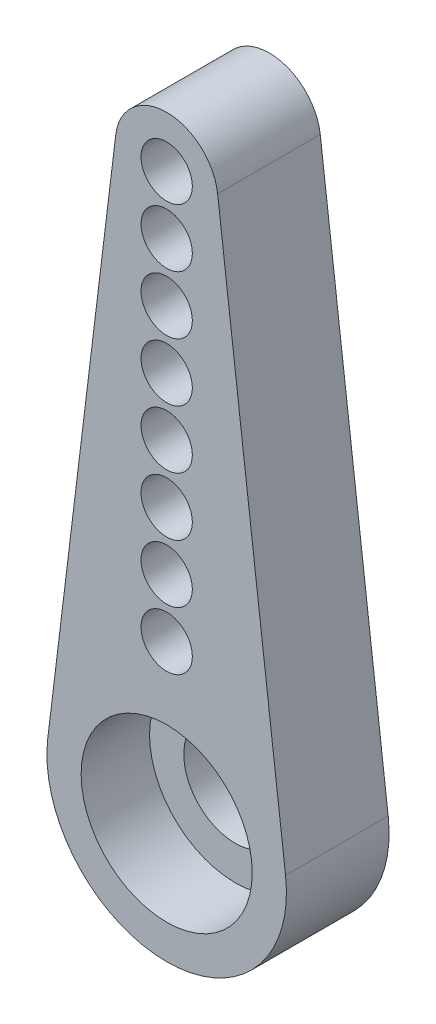
ISO-10303-21;
HEADER;
FILE_DESCRIPTION(('STEP AP214'),'2;1');
FILE_NAME('part.step','',(''),(''),'','','');
FILE_SCHEMA(('AUTOMOTIVE_DESIGN { 1 0 10303 214 1 1 1 1 }'));
ENDSEC;
DATA;
#1=APPLICATION_CONTEXT('core data for automotive mechanical design processes');
#2=APPLICATION_PROTOCOL_DEFINITION('international standard','automotive_design',2000,#1);
#3=PRODUCT_CONTEXT('',#1,'mechanical');
#4=PRODUCT('Part','Part','',(#3));
#5=PRODUCT_RELATED_PRODUCT_CATEGORY('part','',(#4));
#6=PRODUCT_DEFINITION_FORMATION('','',#4);
#7=PRODUCT_DEFINITION_CONTEXT('part definition',#1,'design');
#8=PRODUCT_DEFINITION('design','',#6,#7);
#9=PRODUCT_DEFINITION_SHAPE('','',#8);
#10=(LENGTH_UNIT() NAMED_UNIT(*) SI_UNIT(.MILLI.,.METRE.));
#11=(NAMED_UNIT(*) PLANE_ANGLE_UNIT() SI_UNIT($,.RADIAN.));
#12=(NAMED_UNIT(*) SI_UNIT($,.STERADIAN.) SOLID_ANGLE_UNIT());
#13=UNCERTAINTY_MEASURE_WITH_UNIT(LENGTH_MEASURE(1.E-05),#10,'distance_accuracy_value','');
#14=(GEOMETRIC_REPRESENTATION_CONTEXT(3) GLOBAL_UNCERTAINTY_ASSIGNED_CONTEXT((#13)) GLOBAL_UNIT_ASSIGNED_CONTEXT((#10,
#11,#12)) REPRESENTATION_CONTEXT('',''));
#15=CARTESIAN_POINT('',(0.,0.,0.));
#16=DIRECTION('',(0.,0.,1.));
#17=DIRECTION('',(1.,0.,0.));
#18=AXIS2_PLACEMENT_3D('',#15,#16,#17);
#19=CARTESIAN_POINT('',(0.,16.5,1.));
#20=DIRECTION('',(0.,0.,-1.));
#21=DIRECTION('',(-1.,0.,0.));
#22=AXIS2_PLACEMENT_3D('',#19,#20,#21);
#23=CYLINDRICAL_SURFACE('',#22,1.5);
#24=CARTESIAN_POINT('',(0.,16.5,0.));
#25=DIRECTION('',(0.,0.,1.));
#26=DIRECTION('',(1.,0.,0.));
#27=AXIS2_PLACEMENT_3D('',#24,#25,#26);
#28=CIRCLE('',#27,1.5);
#29=CARTESIAN_POINT('',(1.4889399412872,16.6818181818182,0.));
#30=VERTEX_POINT('',#29);
#31=CARTESIAN_POINT('',(-1.4889399412872,16.6818181818182,0.));
#32=VERTEX_POINT('',#31);
#33=EDGE_CURVE('E126',#30,#32,#28,.T.);
#34=ORIENTED_EDGE('',*,*,#33,.T.);
#35=DIRECTION('',(0.,0.,-1.));
#36=VECTOR('',#35,1.);
#37=CARTESIAN_POINT('',(-1.4889399412872,16.6818181818182,1.));
#38=LINE('',#37,#36);
#39=CARTESIAN_POINT('',(-1.4889399412872,16.6818181818182,3.));
#40=VERTEX_POINT('',#39);
#41=EDGE_CURVE('E45',#40,#32,#38,.T.);
#42=ORIENTED_EDGE('',*,*,#41,.F.);
#43=CARTESIAN_POINT('',(0.,16.5,3.));
#44=DIRECTION('',(0.,0.,1.));
#45=DIRECTION('',(1.,0.,0.));
#46=AXIS2_PLACEMENT_3D('',#43,#44,#45);
#47=CIRCLE('',#46,1.5);
#48=CARTESIAN_POINT('',(1.4889399412872,16.6818181818182,3.));
#49=VERTEX_POINT('',#48);
#50=EDGE_CURVE('E104',#49,#40,#47,.T.);
#51=ORIENTED_EDGE('',*,*,#50,.F.);
#52=DIRECTION('',(0.,0.,-1.));
#53=VECTOR('',#52,1.);
#54=CARTESIAN_POINT('',(1.4889399412872,16.6818181818182,1.));
#55=LINE('',#54,#53);
#56=EDGE_CURVE('E58',#49,#30,#55,.T.);
#57=ORIENTED_EDGE('',*,*,#56,.T.);
#58=EDGE_LOOP('',(#34,#42,#51,#57));
#59=FACE_BOUND('',#58,.T.);
#60=ADVANCED_FACE('F41',(#59),#23,.T.);
#61=CARTESIAN_POINT('',(-3.4741931963368,0.424242424242424,1.));
#62=DIRECTION('',(-0.9926266275248,0.121212121212121,0.));
#63=DIRECTION('',(-0.121212121212121,-0.9926266275248,0.));
#64=AXIS2_PLACEMENT_3D('',#61,#62,#63);
#65=PLANE('',#64);
#66=DIRECTION('',(0.121212121212121,0.9926266275248,0.));
#67=VECTOR('',#66,1.);
#68=CARTESIAN_POINT('',(-3.4741931963368,0.424242424242424,0.));
#69=LINE('',#68,#67);
#70=CARTESIAN_POINT('',(-3.4741931963368,0.424242424242424,0.));
#71=VERTEX_POINT('',#70);
#72=EDGE_CURVE('E92',#71,#32,#69,.T.);
#73=ORIENTED_EDGE('',*,*,#72,.F.);
#74=DIRECTION('',(0.,0.,-1.));
#75=VECTOR('',#74,1.);
#76=CARTESIAN_POINT('',(-3.4741931963368,0.424242424242424,1.));
#77=LINE('',#76,#75);
#78=CARTESIAN_POINT('',(-3.4741931963368,0.424242424242424,3.));
#79=VERTEX_POINT('',#78);
#80=EDGE_CURVE('E86',#79,#71,#77,.T.);
#81=ORIENTED_EDGE('',*,*,#80,.F.);
#82=DIRECTION('',(0.121212121212121,0.9926266275248,0.));
#83=VECTOR('',#82,1.);
#84=CARTESIAN_POINT('',(-3.4741931963368,0.424242424242424,3.));
#85=LINE('',#84,#83);
#86=EDGE_CURVE('E90',#79,#40,#85,.T.);
#87=ORIENTED_EDGE('',*,*,#86,.T.);
#88=ORIENTED_EDGE('',*,*,#41,.T.);
#89=EDGE_LOOP('',(#73,#81,#87,#88));
#90=FACE_BOUND('',#89,.T.);
#91=ADVANCED_FACE('F88',(#90),#65,.T.);
#92=CARTESIAN_POINT('',(0.,0.,1.));
#93=DIRECTION('',(0.,0.,-1.));
#94=DIRECTION('',(-1.,0.,0.));
#95=AXIS2_PLACEMENT_3D('',#92,#93,#94);
#96=CYLINDRICAL_SURFACE('',#95,3.5);
#97=CARTESIAN_POINT('',(0.,0.,0.));
#98=DIRECTION('',(0.,0.,1.));
#99=DIRECTION('',(1.,0.,0.));
#100=AXIS2_PLACEMENT_3D('',#97,#98,#99);
#101=CIRCLE('',#100,3.5);
#102=CARTESIAN_POINT('',(3.4741931963368,0.424242424242424,0.));
#103=VERTEX_POINT('',#102);
#104=EDGE_CURVE('E129',#71,#103,#101,.T.);
#105=ORIENTED_EDGE('',*,*,#104,.T.);
#106=DIRECTION('',(0.,0.,-1.));
#107=VECTOR('',#106,1.);
#108=CARTESIAN_POINT('',(3.4741931963368,0.424242424242424,1.));
#109=LINE('',#108,#107);
#110=CARTESIAN_POINT('',(3.4741931963368,0.424242424242424,3.));
#111=VERTEX_POINT('',#110);
#112=EDGE_CURVE('E66',#111,#103,#109,.T.);
#113=ORIENTED_EDGE('',*,*,#112,.F.);
#114=CARTESIAN_POINT('',(0.,0.,3.));
#115=DIRECTION('',(0.,0.,1.));
#116=DIRECTION('',(1.,0.,0.));
#117=AXIS2_PLACEMENT_3D('',#114,#115,#116);
#118=CIRCLE('',#117,3.5);
#119=EDGE_CURVE('E96',#79,#111,#118,.T.);
#120=ORIENTED_EDGE('',*,*,#119,.F.);
#121=ORIENTED_EDGE('',*,*,#80,.T.);
#122=EDGE_LOOP('',(#105,#113,#120,#121));
#123=FACE_BOUND('',#122,.T.);
#124=ADVANCED_FACE('F97',(#123),#96,.T.);
#125=CARTESIAN_POINT('',(0.,8.,1.));
#126=DIRECTION('',(0.,0.,-1.));
#127=DIRECTION('',(-1.,0.,0.));
#128=AXIS2_PLACEMENT_3D('',#125,#126,#127);
#129=CYLINDRICAL_SURFACE('',#128,0.750000000000002);
#130=CARTESIAN_POINT('',(0.,8.,0.));
#131=DIRECTION('',(0.,0.,1.));
#132=DIRECTION('',(1.,0.,0.));
#133=AXIS2_PLACEMENT_3D('',#130,#131,#132);
#134=CIRCLE('',#133,0.750000000000002);
#135=CARTESIAN_POINT('',(0.750000000000061,8.,0.));
#136=VERTEX_POINT('',#135);
#137=EDGE_CURVE('E146',#136,#136,#134,.T.);
#138=ORIENTED_EDGE('',*,*,#137,.F.);
#139=EDGE_LOOP('',(#138));
#140=FACE_BOUND('',#139,.T.);
#141=CARTESIAN_POINT('',(0.,8.,3.));
#142=DIRECTION('',(0.,0.,1.));
#143=DIRECTION('',(1.,0.,0.));
#144=AXIS2_PLACEMENT_3D('',#141,#142,#143);
#145=CIRCLE('',#144,0.750000000000002);
#146=CARTESIAN_POINT('',(0.750000000000061,8.,3.));
#147=VERTEX_POINT('',#146);
#148=EDGE_CURVE('E166',#147,#147,#145,.T.);
#149=ORIENTED_EDGE('',*,*,#148,.T.);
#150=EDGE_LOOP('',(#149));
#151=FACE_BOUND('',#150,.T.);
#152=ADVANCED_FACE('F245',(#140,#151),#129,.F.);
#153=CARTESIAN_POINT('',(0.,11.4,1.));
#154=DIRECTION('',(0.,0.,-1.));
#155=DIRECTION('',(-1.,0.,0.));
#156=AXIS2_PLACEMENT_3D('',#153,#154,#155);
#157=CYLINDRICAL_SURFACE('',#156,0.750000000000002);
#158=CARTESIAN_POINT('',(0.,11.4,0.));
#159=DIRECTION('',(0.,0.,1.));
#160=DIRECTION('',(1.,0.,0.));
#161=AXIS2_PLACEMENT_3D('',#158,#159,#160);
#162=CIRCLE('',#161,0.750000000000002);
#163=CARTESIAN_POINT('',(0.750000000000038,11.4,0.));
#164=VERTEX_POINT('',#163);
#165=EDGE_CURVE('E143',#164,#164,#162,.T.);
#166=ORIENTED_EDGE('',*,*,#165,.F.);
#167=EDGE_LOOP('',(#166));
#168=FACE_BOUND('',#167,.T.);
#169=CARTESIAN_POINT('',(0.,11.4,3.));
#170=DIRECTION('',(0.,0.,1.));
#171=DIRECTION('',(1.,0.,0.));
#172=AXIS2_PLACEMENT_3D('',#169,#170,#171);
#173=CIRCLE('',#172,0.750000000000002);
#174=CARTESIAN_POINT('',(0.750000000000038,11.4,3.));
#175=VERTEX_POINT('',#174);
#176=EDGE_CURVE('E179',#175,#175,#173,.T.);
#177=ORIENTED_EDGE('',*,*,#176,.T.);
#178=EDGE_LOOP('',(#177));
#179=FACE_BOUND('',#178,.T.);
#180=ADVANCED_FACE('F239',(#168,#179),#157,.F.);
#181=CARTESIAN_POINT('',(0.,13.1,1.));
#182=DIRECTION('',(0.,0.,-1.));
#183=DIRECTION('',(-1.,0.,0.));
#184=AXIS2_PLACEMENT_3D('',#181,#182,#183);
#185=CYLINDRICAL_SURFACE('',#184,0.750000000000002);
#186=CARTESIAN_POINT('',(0.,13.1,0.));
#187=DIRECTION('',(0.,0.,1.));
#188=DIRECTION('',(1.,0.,0.));
#189=AXIS2_PLACEMENT_3D('',#186,#187,#188);
#190=CIRCLE('',#189,0.750000000000002);
#191=CARTESIAN_POINT('',(0.750000000000026,13.1,0.));
#192=VERTEX_POINT('',#191);
#193=EDGE_CURVE('E140',#192,#192,#190,.T.);
#194=ORIENTED_EDGE('',*,*,#193,.F.);
#195=EDGE_LOOP('',(#194));
#196=FACE_BOUND('',#195,.T.);
#197=CARTESIAN_POINT('',(0.,13.1,3.));
#198=DIRECTION('',(0.,0.,1.));
#199=DIRECTION('',(1.,0.,0.));
#200=AXIS2_PLACEMENT_3D('',#197,#198,#199);
#201=CIRCLE('',#200,0.750000000000002);
#202=CARTESIAN_POINT('',(0.750000000000026,13.1,3.));
#203=VERTEX_POINT('',#202);
#204=EDGE_CURVE('E182',#203,#203,#201,.T.);
#205=ORIENTED_EDGE('',*,*,#204,.T.);
#206=EDGE_LOOP('',(#205));
#207=FACE_BOUND('',#206,.T.);
#208=ADVANCED_FACE('F208',(#196,#207),#185,.F.);
#209=CARTESIAN_POINT('',(0.,14.8,1.));
#210=DIRECTION('',(0.,0.,-1.));
#211=DIRECTION('',(-1.,0.,0.));
#212=AXIS2_PLACEMENT_3D('',#209,#210,#211);
#213=CYLINDRICAL_SURFACE('',#212,0.750000000000002);
#214=CARTESIAN_POINT('',(0.,14.8,0.));
#215=DIRECTION('',(0.,0.,1.));
#216=DIRECTION('',(1.,0.,0.));
#217=AXIS2_PLACEMENT_3D('',#214,#215,#216);
#218=CIRCLE('',#217,0.750000000000002);
#219=CARTESIAN_POINT('',(0.750000000000014,14.8,0.));
#220=VERTEX_POINT('',#219);
#221=EDGE_CURVE('E137',#220,#220,#218,.T.);
#222=ORIENTED_EDGE('',*,*,#221,.F.);
#223=EDGE_LOOP('',(#222));
#224=FACE_BOUND('',#223,.T.);
#225=CARTESIAN_POINT('',(0.,14.8,3.));
#226=DIRECTION('',(0.,0.,1.));
#227=DIRECTION('',(1.,0.,0.));
#228=AXIS2_PLACEMENT_3D('',#225,#226,#227);
#229=CIRCLE('',#228,0.750000000000002);
#230=CARTESIAN_POINT('',(0.750000000000014,14.8,3.));
#231=VERTEX_POINT('',#230);
#232=EDGE_CURVE('E108',#231,#231,#229,.T.);
#233=ORIENTED_EDGE('',*,*,#232,.T.);
#234=EDGE_LOOP('',(#233));
#235=FACE_BOUND('',#234,.T.);
#236=ADVANCED_FACE('F187',(#224,#235),#213,.F.);
#237=CARTESIAN_POINT('',(0.,16.5,1.));
#238=DIRECTION('',(0.,0.,-1.));
#239=DIRECTION('',(-1.,0.,0.));
#240=AXIS2_PLACEMENT_3D('',#237,#238,#239);
#241=CYLINDRICAL_SURFACE('',#240,0.750000000000002);
#242=CARTESIAN_POINT('',(0.,16.5,0.));
#243=DIRECTION('',(0.,0.,1.));
#244=DIRECTION('',(1.,0.,0.));
#245=AXIS2_PLACEMENT_3D('',#242,#243,#244);
#246=CIRCLE('',#245,0.750000000000002);
#247=CARTESIAN_POINT('',(0.750000000000002,16.5,0.));
#248=VERTEX_POINT('',#247);
#249=EDGE_CURVE('E134',#248,#248,#246,.T.);
#250=ORIENTED_EDGE('',*,*,#249,.F.);
#251=EDGE_LOOP('',(#250));
#252=FACE_BOUND('',#251,.T.);
#253=CARTESIAN_POINT('',(0.,16.5,3.));
#254=DIRECTION('',(0.,0.,1.));
#255=DIRECTION('',(1.,0.,0.));
#256=AXIS2_PLACEMENT_3D('',#253,#254,#255);
#257=CIRCLE('',#256,0.750000000000002);
#258=CARTESIAN_POINT('',(0.750000000000002,16.5,3.));
#259=VERTEX_POINT('',#258);
#260=EDGE_CURVE('E105',#259,#259,#257,.T.);
#261=ORIENTED_EDGE('',*,*,#260,.T.);
#262=EDGE_LOOP('',(#261));
#263=FACE_BOUND('',#262,.T.);
#264=ADVANCED_FACE('F197',(#252,#263),#241,.F.);
#265=CARTESIAN_POINT('',(3.4741931963368,0.424242424242424,1.));
#266=DIRECTION('',(0.9926266275248,0.121212121212121,0.));
#267=DIRECTION('',(-0.121212121212121,0.9926266275248,0.));
#268=AXIS2_PLACEMENT_3D('',#265,#266,#267);
#269=PLANE('',#268);
#270=DIRECTION('',(0.121212121212121,-0.9926266275248,0.));
#271=VECTOR('',#270,1.);
#272=CARTESIAN_POINT('',(3.4741931963368,0.424242424242424,0.));
#273=LINE('',#272,#271);
#274=EDGE_CURVE('E131',#30,#103,#273,.T.);
#275=ORIENTED_EDGE('',*,*,#274,.F.);
#276=ORIENTED_EDGE('',*,*,#56,.F.);
#277=DIRECTION('',(0.121212121212121,-0.9926266275248,0.));
#278=VECTOR('',#277,1.);
#279=CARTESIAN_POINT('',(3.4741931963368,0.424242424242424,3.));
#280=LINE('',#279,#278);
#281=EDGE_CURVE('E100',#49,#111,#280,.T.);
#282=ORIENTED_EDGE('',*,*,#281,.T.);
#283=ORIENTED_EDGE('',*,*,#112,.T.);
#284=EDGE_LOOP('',(#275,#276,#282,#283));
#285=FACE_BOUND('',#284,.T.);
#286=ADVANCED_FACE('F199',(#285),#269,.T.);
#287=CARTESIAN_POINT('',(0.,4.6,1.));
#288=DIRECTION('',(0.,0.,-1.));
#289=DIRECTION('',(-1.,0.,0.));
#290=AXIS2_PLACEMENT_3D('',#287,#288,#289);
#291=CYLINDRICAL_SURFACE('',#290,0.750000000000002);
#292=CARTESIAN_POINT('',(0.,4.6,0.));
#293=DIRECTION('',(0.,0.,1.));
#294=DIRECTION('',(1.,0.,0.));
#295=AXIS2_PLACEMENT_3D('',#292,#293,#294);
#296=CIRCLE('',#295,0.750000000000002);
#297=CARTESIAN_POINT('',(0.750000000000085,4.6,0.));
#298=VERTEX_POINT('',#297);
#299=EDGE_CURVE('E123',#298,#298,#296,.T.);
#300=ORIENTED_EDGE('',*,*,#299,.F.);
#301=EDGE_LOOP('',(#300));
#302=FACE_BOUND('',#301,.T.);
#303=CARTESIAN_POINT('',(0.,4.6,3.));
#304=DIRECTION('',(0.,0.,1.));
#305=DIRECTION('',(1.,0.,0.));
#306=AXIS2_PLACEMENT_3D('',#303,#304,#305);
#307=CIRCLE('',#306,0.750000000000002);
#308=CARTESIAN_POINT('',(0.750000000000085,4.6,3.));
#309=VERTEX_POINT('',#308);
#310=EDGE_CURVE('E167',#309,#309,#307,.T.);
#311=ORIENTED_EDGE('',*,*,#310,.T.);
#312=EDGE_LOOP('',(#311));
#313=FACE_BOUND('',#312,.T.);
#314=ADVANCED_FACE('F206',(#302,#313),#291,.F.);
#315=CARTESIAN_POINT('',(0.,0.,1.));
#316=DIRECTION('',(0.,0.,-1.));
#317=DIRECTION('',(-1.,0.,0.));
#318=AXIS2_PLACEMENT_3D('',#315,#316,#317);
#319=CYLINDRICAL_SURFACE('',#318,1.5);
#320=CARTESIAN_POINT('',(0.,0.,1.));
#321=DIRECTION('',(0.,0.,1.));
#322=DIRECTION('',(1.,0.,0.));
#323=AXIS2_PLACEMENT_3D('',#320,#321,#322);
#324=CIRCLE('',#323,1.5);
#325=CARTESIAN_POINT('',(1.5,0.,1.));
#326=VERTEX_POINT('',#325);
#327=EDGE_CURVE('E117',#326,#326,#324,.T.);
#328=ORIENTED_EDGE('',*,*,#327,.T.);
#329=EDGE_LOOP('',(#328));
#330=FACE_BOUND('',#329,.T.);
#331=CARTESIAN_POINT('',(0.,0.,0.));
#332=DIRECTION('',(0.,0.,1.));
#333=DIRECTION('',(1.,0.,0.));
#334=AXIS2_PLACEMENT_3D('',#331,#332,#333);
#335=CIRCLE('',#334,1.5);
#336=CARTESIAN_POINT('',(1.5,0.,0.));
#337=VERTEX_POINT('',#336);
#338=EDGE_CURVE('E114',#337,#337,#335,.T.);
#339=ORIENTED_EDGE('',*,*,#338,.F.);
#340=EDGE_LOOP('',(#339));
#341=FACE_BOUND('',#340,.T.);
#342=ADVANCED_FACE('F43',(#330,#341),#319,.F.);
#343=CARTESIAN_POINT('',(0.,6.3,1.));
#344=DIRECTION('',(0.,0.,-1.));
#345=DIRECTION('',(-1.,0.,0.));
#346=AXIS2_PLACEMENT_3D('',#343,#344,#345);
#347=CYLINDRICAL_SURFACE('',#346,0.750000000000002);
#348=CARTESIAN_POINT('',(0.,6.3,0.));
#349=DIRECTION('',(0.,0.,1.));
#350=DIRECTION('',(1.,0.,0.));
#351=AXIS2_PLACEMENT_3D('',#348,#349,#350);
#352=CIRCLE('',#351,0.750000000000002);
#353=CARTESIAN_POINT('',(0.750000000000073,6.3,0.));
#354=VERTEX_POINT('',#353);
#355=EDGE_CURVE('E120',#354,#354,#352,.T.);
#356=ORIENTED_EDGE('',*,*,#355,.F.);
#357=EDGE_LOOP('',(#356));
#358=FACE_BOUND('',#357,.T.);
#359=CARTESIAN_POINT('',(0.,6.3,3.));
#360=DIRECTION('',(0.,0.,1.));
#361=DIRECTION('',(1.,0.,0.));
#362=AXIS2_PLACEMENT_3D('',#359,#360,#361);
#363=CIRCLE('',#362,0.750000000000002);
#364=CARTESIAN_POINT('',(0.750000000000073,6.3,3.));
#365=VERTEX_POINT('',#364);
#366=EDGE_CURVE('E164',#365,#365,#363,.T.);
#367=ORIENTED_EDGE('',*,*,#366,.T.);
#368=EDGE_LOOP('',(#367));
#369=FACE_BOUND('',#368,.T.);
#370=ADVANCED_FACE('F157',(#358,#369),#347,.F.);
#371=CARTESIAN_POINT('',(0.,0.,1.));
#372=DIRECTION('',(0.,0.,1.));
#373=DIRECTION('',(1.,0.,0.));
#374=AXIS2_PLACEMENT_3D('',#371,#372,#373);
#375=PLANE('',#374);
#376=CARTESIAN_POINT('',(0.,0.,1.));
#377=DIRECTION('',(0.,0.,1.));
#378=DIRECTION('',(1.,0.,0.));
#379=AXIS2_PLACEMENT_3D('',#376,#377,#378);
#380=CIRCLE('',#379,2.5);
#381=CARTESIAN_POINT('',(2.5,0.,1.));
#382=VERTEX_POINT('',#381);
#383=EDGE_CURVE('E50',#382,#382,#380,.F.);
#384=ORIENTED_EDGE('',*,*,#383,.F.);
#385=EDGE_LOOP('',(#384));
#386=FACE_BOUND('',#385,.T.);
#387=ORIENTED_EDGE('',*,*,#327,.F.);
#388=EDGE_LOOP('',(#387));
#389=FACE_BOUND('',#388,.T.);
#390=ADVANCED_FACE('F160',(#386,#389),#375,.T.);
#391=CARTESIAN_POINT('',(0.,0.,0.));
#392=DIRECTION('',(0.,0.,1.));
#393=DIRECTION('',(1.,0.,0.));
#394=AXIS2_PLACEMENT_3D('',#391,#392,#393);
#395=PLANE('',#394);
#396=ORIENTED_EDGE('',*,*,#338,.T.);
#397=EDGE_LOOP('',(#396));
#398=FACE_BOUND('',#397,.T.);
#399=ORIENTED_EDGE('',*,*,#355,.T.);
#400=EDGE_LOOP('',(#399));
#401=FACE_BOUND('',#400,.T.);
#402=ORIENTED_EDGE('',*,*,#137,.T.);
#403=EDGE_LOOP('',(#402));
#404=FACE_BOUND('',#403,.T.);
#405=ORIENTED_EDGE('',*,*,#165,.T.);
#406=EDGE_LOOP('',(#405));
#407=FACE_BOUND('',#406,.T.);
#408=ORIENTED_EDGE('',*,*,#193,.T.);
#409=EDGE_LOOP('',(#408));
#410=FACE_BOUND('',#409,.T.);
#411=ORIENTED_EDGE('',*,*,#221,.T.);
#412=EDGE_LOOP('',(#411));
#413=FACE_BOUND('',#412,.T.);
#414=ORIENTED_EDGE('',*,*,#249,.T.);
#415=EDGE_LOOP('',(#414));
#416=FACE_BOUND('',#415,.T.);
#417=ORIENTED_EDGE('',*,*,#33,.F.);
#418=ORIENTED_EDGE('',*,*,#274,.T.);
#419=ORIENTED_EDGE('',*,*,#104,.F.);
#420=ORIENTED_EDGE('',*,*,#72,.T.);
#421=EDGE_LOOP('',(#417,#418,#419,#420));
#422=FACE_BOUND('',#421,.T.);
#423=ORIENTED_EDGE('',*,*,#299,.T.);
#424=EDGE_LOOP('',(#423));
#425=FACE_BOUND('',#424,.T.);
#426=ADVANCED_FACE('F154',(#398,#401,#404,#407,#410,#413,#416,#422,#425),#395,.F.);
#427=CARTESIAN_POINT('',(0.,9.7,3.));
#428=DIRECTION('',(0.,0.,-1.));
#429=DIRECTION('',(-1.,0.,0.));
#430=AXIS2_PLACEMENT_3D('',#427,#428,#429);
#431=CYLINDRICAL_SURFACE('',#430,0.750000000000002);
#432=CARTESIAN_POINT('',(0.,9.7,1.));
#433=DIRECTION('',(0.,0.,1.));
#434=DIRECTION('',(1.,0.,0.));
#435=AXIS2_PLACEMENT_3D('',#432,#433,#434);
#436=CIRCLE('',#435,0.750000000000002);
#437=CARTESIAN_POINT('',(0.75000000000005,9.7,1.));
#438=VERTEX_POINT('',#437);
#439=EDGE_CURVE('E11',#438,#438,#436,.F.);
#440=ORIENTED_EDGE('',*,*,#439,.T.);
#441=EDGE_LOOP('',(#440));
#442=FACE_BOUND('',#441,.T.);
#443=CARTESIAN_POINT('',(0.,9.7,3.));
#444=DIRECTION('',(0.,0.,1.));
#445=DIRECTION('',(1.,0.,0.));
#446=AXIS2_PLACEMENT_3D('',#443,#444,#445);
#447=CIRCLE('',#446,0.750000000000002);
#448=CARTESIAN_POINT('',(0.75000000000005,9.7,3.));
#449=VERTEX_POINT('',#448);
#450=EDGE_CURVE('E170',#449,#449,#447,.T.);
#451=ORIENTED_EDGE('',*,*,#450,.T.);
#452=EDGE_LOOP('',(#451));
#453=FACE_BOUND('',#452,.T.);
#454=ADVANCED_FACE('F255',(#442,#453),#431,.F.);
#455=CARTESIAN_POINT('',(0.,0.,3.));
#456=DIRECTION('',(0.,0.,-1.));
#457=DIRECTION('',(-1.,0.,0.));
#458=AXIS2_PLACEMENT_3D('',#455,#456,#457);
#459=CYLINDRICAL_SURFACE('',#458,2.5);
#460=ORIENTED_EDGE('',*,*,#383,.T.);
#461=EDGE_LOOP('',(#460));
#462=FACE_BOUND('',#461,.T.);
#463=CARTESIAN_POINT('',(0.,0.,3.));
#464=DIRECTION('',(0.,0.,1.));
#465=DIRECTION('',(1.,0.,0.));
#466=AXIS2_PLACEMENT_3D('',#463,#464,#465);
#467=CIRCLE('',#466,2.5);
#468=CARTESIAN_POINT('',(2.5,0.,3.));
#469=VERTEX_POINT('',#468);
#470=EDGE_CURVE('E173',#469,#469,#467,.T.);
#471=ORIENTED_EDGE('',*,*,#470,.T.);
#472=EDGE_LOOP('',(#471));
#473=FACE_BOUND('',#472,.T.);
#474=ADVANCED_FACE('F192',(#462,#473),#459,.F.);
#475=CARTESIAN_POINT('',(0.,0.,3.));
#476=DIRECTION('',(0.,0.,1.));
#477=DIRECTION('',(1.,0.,0.));
#478=AXIS2_PLACEMENT_3D('',#475,#476,#477);
#479=PLANE('',#478);
#480=ORIENTED_EDGE('',*,*,#470,.F.);
#481=EDGE_LOOP('',(#480));
#482=FACE_BOUND('',#481,.T.);
#483=ORIENTED_EDGE('',*,*,#310,.F.);
#484=EDGE_LOOP('',(#483));
#485=FACE_BOUND('',#484,.T.);
#486=ORIENTED_EDGE('',*,*,#366,.F.);
#487=EDGE_LOOP('',(#486));
#488=FACE_BOUND('',#487,.T.);
#489=ORIENTED_EDGE('',*,*,#148,.F.);
#490=EDGE_LOOP('',(#489));
#491=FACE_BOUND('',#490,.T.);
#492=ORIENTED_EDGE('',*,*,#450,.F.);
#493=EDGE_LOOP('',(#492));
#494=FACE_BOUND('',#493,.T.);
#495=ORIENTED_EDGE('',*,*,#176,.F.);
#496=EDGE_LOOP('',(#495));
#497=FACE_BOUND('',#496,.T.);
#498=ORIENTED_EDGE('',*,*,#204,.F.);
#499=EDGE_LOOP('',(#498));
#500=FACE_BOUND('',#499,.T.);
#501=ORIENTED_EDGE('',*,*,#232,.F.);
#502=EDGE_LOOP('',(#501));
#503=FACE_BOUND('',#502,.T.);
#504=ORIENTED_EDGE('',*,*,#260,.F.);
#505=EDGE_LOOP('',(#504));
#506=FACE_BOUND('',#505,.T.);
#507=ORIENTED_EDGE('',*,*,#86,.F.);
#508=ORIENTED_EDGE('',*,*,#119,.T.);
#509=ORIENTED_EDGE('',*,*,#281,.F.);
#510=ORIENTED_EDGE('',*,*,#50,.T.);
#511=EDGE_LOOP('',(#507,#508,#509,#510));
#512=FACE_BOUND('',#511,.T.);
#513=ADVANCED_FACE('F103',(#482,#485,#488,#491,#494,#497,#500,#503,#506,#512),#479,.T.);
#514=ORIENTED_EDGE('',*,*,#439,.F.);
#515=EDGE_LOOP('',(#514));
#516=FACE_BOUND('',#515,.T.);
#517=ADVANCED_FACE('F191',(#516),#375,.T.);
#518=CLOSED_SHELL('',(#60,#91,#124,#152,#180,#208,#236,#264,#286,#314,#342,#370,#390,#426,#454,
#474,#513,#517));
#519=MANIFOLD_SOLID_BREP('B2',#518);
#520=ADVANCED_BREP_SHAPE_REPRESENTATION('',(#18,#519),#14);
#521=SHAPE_DEFINITION_REPRESENTATION(#9,#520);
ENDSEC;
END-ISO-10303-21;
